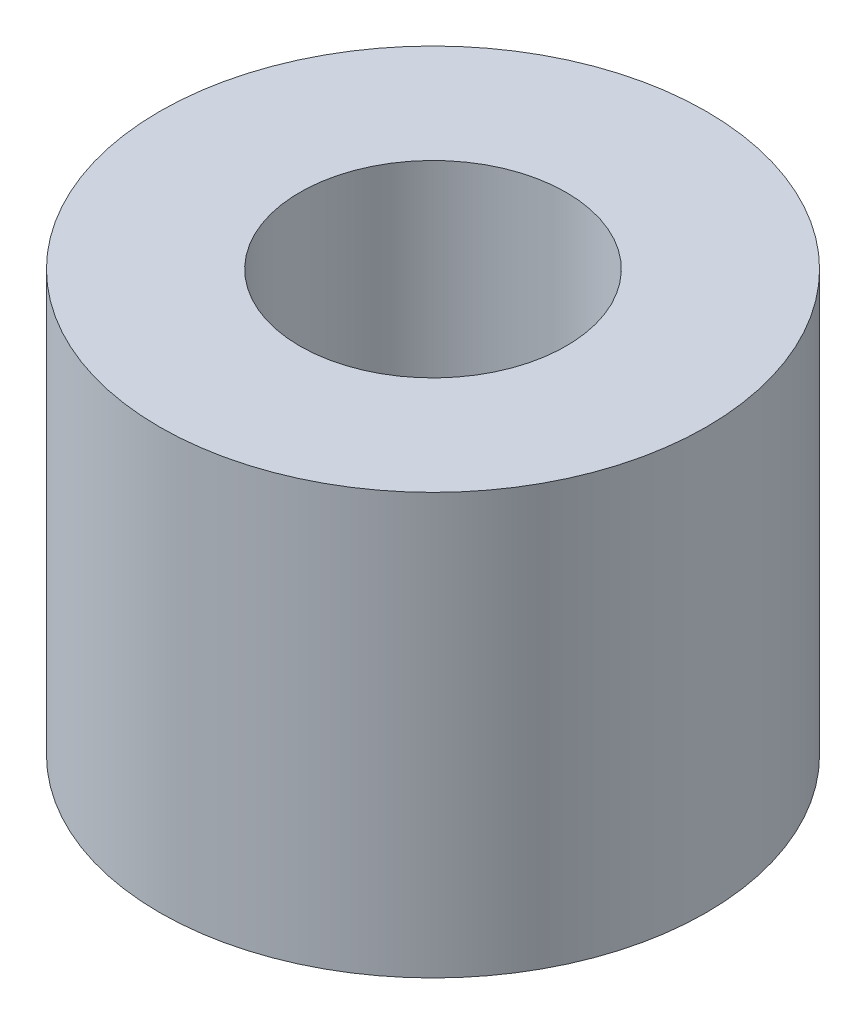
ISO-10303-21;
HEADER;
FILE_DESCRIPTION(('STEP AP214'),'2;1');
FILE_NAME('part.step','',(''),(''),'','','');
FILE_SCHEMA(('AUTOMOTIVE_DESIGN { 1 0 10303 214 1 1 1 1 }'));
ENDSEC;
DATA;
#1=APPLICATION_CONTEXT('core data for automotive mechanical design processes');
#2=APPLICATION_PROTOCOL_DEFINITION('international standard','automotive_design',2000,#1);
#3=PRODUCT_CONTEXT('',#1,'mechanical');
#4=PRODUCT('Part','Part','',(#3));
#5=PRODUCT_RELATED_PRODUCT_CATEGORY('part','',(#4));
#6=PRODUCT_DEFINITION_FORMATION('','',#4);
#7=PRODUCT_DEFINITION_CONTEXT('part definition',#1,'design');
#8=PRODUCT_DEFINITION('design','',#6,#7);
#9=PRODUCT_DEFINITION_SHAPE('','',#8);
#10=(LENGTH_UNIT() NAMED_UNIT(*) SI_UNIT(.MILLI.,.METRE.));
#11=(NAMED_UNIT(*) PLANE_ANGLE_UNIT() SI_UNIT($,.RADIAN.));
#12=(NAMED_UNIT(*) SI_UNIT($,.STERADIAN.) SOLID_ANGLE_UNIT());
#13=UNCERTAINTY_MEASURE_WITH_UNIT(LENGTH_MEASURE(1.E-05),#10,'distance_accuracy_value','');
#14=(GEOMETRIC_REPRESENTATION_CONTEXT(3) GLOBAL_UNCERTAINTY_ASSIGNED_CONTEXT((#13)) GLOBAL_UNIT_ASSIGNED_CONTEXT((#10,
#11,#12)) REPRESENTATION_CONTEXT('',''));
#15=CARTESIAN_POINT('',(0.,0.,0.));
#16=DIRECTION('',(0.,0.,1.));
#17=DIRECTION('',(1.,0.,0.));
#18=AXIS2_PLACEMENT_3D('',#15,#16,#17);
#19=CARTESIAN_POINT('',(0.,-7.,0.));
#20=DIRECTION('',(0.,-1.,0.));
#21=DIRECTION('',(0.,0.,-1.));
#22=AXIS2_PLACEMENT_3D('',#19,#20,#21);
#23=CYLINDRICAL_SURFACE('',#22,1.9);
#24=CARTESIAN_POINT('',(0.,-3.,0.));
#25=DIRECTION('',(0.,-1.,0.));
#26=DIRECTION('',(0.,0.,-1.));
#27=AXIS2_PLACEMENT_3D('',#24,#25,#26);
#28=CIRCLE('',#27,1.9);
#29=CARTESIAN_POINT('',(0.,-3.,-1.9));
#30=VERTEX_POINT('',#29);
#31=EDGE_CURVE('E10',#30,#30,#28,.T.);
#32=ORIENTED_EDGE('',*,*,#31,.T.);
#33=EDGE_LOOP('',(#32));
#34=FACE_BOUND('',#33,.T.);
#35=CARTESIAN_POINT('',(0.,3.,0.));
#36=DIRECTION('',(0.,-1.,0.));
#37=DIRECTION('',(0.,0.,-1.));
#38=AXIS2_PLACEMENT_3D('',#35,#36,#37);
#39=CIRCLE('',#38,1.9);
#40=CARTESIAN_POINT('',(0.,3.,-1.9));
#41=VERTEX_POINT('',#40);
#42=EDGE_CURVE('E45',#41,#41,#39,.T.);
#43=ORIENTED_EDGE('',*,*,#42,.F.);
#44=EDGE_LOOP('',(#43));
#45=FACE_BOUND('',#44,.T.);
#46=ADVANCED_FACE('F31',(#34,#45),#23,.F.);
#47=CARTESIAN_POINT('',(1.9,-3.,0.));
#48=DIRECTION('',(0.,-1.,0.));
#49=DIRECTION('',(0.,0.,-1.));
#50=AXIS2_PLACEMENT_3D('',#47,#48,#49);
#51=PLANE('',#50);
#52=CARTESIAN_POINT('',(0.,-3.,0.));
#53=DIRECTION('',(0.,-1.,0.));
#54=DIRECTION('',(0.,0.,-1.));
#55=AXIS2_PLACEMENT_3D('',#52,#53,#54);
#56=CIRCLE('',#55,3.9);
#57=CARTESIAN_POINT('',(0.,-3.,-3.9));
#58=VERTEX_POINT('',#57);
#59=EDGE_CURVE('E37',#58,#58,#56,.T.);
#60=ORIENTED_EDGE('',*,*,#59,.T.);
#61=EDGE_LOOP('',(#60));
#62=FACE_BOUND('',#61,.T.);
#63=ORIENTED_EDGE('',*,*,#31,.F.);
#64=EDGE_LOOP('',(#63));
#65=FACE_BOUND('',#64,.T.);
#66=ADVANCED_FACE('F55',(#62,#65),#51,.T.);
#67=CARTESIAN_POINT('',(0.,-7.,0.));
#68=DIRECTION('',(0.,-1.,0.));
#69=DIRECTION('',(0.,0.,-1.));
#70=AXIS2_PLACEMENT_3D('',#67,#68,#69);
#71=CYLINDRICAL_SURFACE('',#70,3.9);
#72=CARTESIAN_POINT('',(0.,3.,0.));
#73=DIRECTION('',(0.,-1.,0.));
#74=DIRECTION('',(0.,0.,-1.));
#75=AXIS2_PLACEMENT_3D('',#72,#73,#74);
#76=CIRCLE('',#75,3.9);
#77=CARTESIAN_POINT('',(0.,3.,-3.9));
#78=VERTEX_POINT('',#77);
#79=EDGE_CURVE('E41',#78,#78,#76,.T.);
#80=ORIENTED_EDGE('',*,*,#79,.T.);
#81=EDGE_LOOP('',(#80));
#82=FACE_BOUND('',#81,.T.);
#83=ORIENTED_EDGE('',*,*,#59,.F.);
#84=EDGE_LOOP('',(#83));
#85=FACE_BOUND('',#84,.T.);
#86=ADVANCED_FACE('F59',(#82,#85),#71,.T.);
#87=CARTESIAN_POINT('',(3.9,3.,0.));
#88=DIRECTION('',(0.,1.,0.));
#89=DIRECTION('',(0.,0.,1.));
#90=AXIS2_PLACEMENT_3D('',#87,#88,#89);
#91=PLANE('',#90);
#92=ORIENTED_EDGE('',*,*,#42,.T.);
#93=EDGE_LOOP('',(#92));
#94=FACE_BOUND('',#93,.T.);
#95=ORIENTED_EDGE('',*,*,#79,.F.);
#96=EDGE_LOOP('',(#95));
#97=FACE_BOUND('',#96,.T.);
#98=ADVANCED_FACE('F51',(#94,#97),#91,.T.);
#99=CLOSED_SHELL('',(#46,#66,#86,#98));
#100=MANIFOLD_SOLID_BREP('B2',#99);
#101=ADVANCED_BREP_SHAPE_REPRESENTATION('',(#18,#100),#14);
#102=SHAPE_DEFINITION_REPRESENTATION(#9,#101);
ENDSEC;
END-ISO-10303-21;
